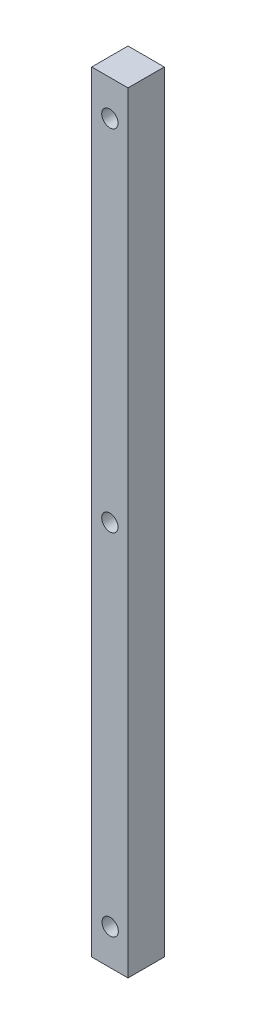
ISO-10303-21;
HEADER;
FILE_DESCRIPTION(('STEP AP214'),'2;1');
FILE_NAME('part.step','',(''),(''),'','','');
FILE_SCHEMA(('AUTOMOTIVE_DESIGN { 1 0 10303 214 1 1 1 1 }'));
ENDSEC;
DATA;
#1=APPLICATION_CONTEXT('core data for automotive mechanical design processes');
#2=APPLICATION_PROTOCOL_DEFINITION('international standard','automotive_design',2000,#1);
#3=PRODUCT_CONTEXT('',#1,'mechanical');
#4=PRODUCT('Part','Part','',(#3));
#5=PRODUCT_RELATED_PRODUCT_CATEGORY('part','',(#4));
#6=PRODUCT_DEFINITION_FORMATION('','',#4);
#7=PRODUCT_DEFINITION_CONTEXT('part definition',#1,'design');
#8=PRODUCT_DEFINITION('design','',#6,#7);
#9=PRODUCT_DEFINITION_SHAPE('','',#8);
#10=(LENGTH_UNIT() NAMED_UNIT(*) SI_UNIT(.MILLI.,.METRE.));
#11=(NAMED_UNIT(*) PLANE_ANGLE_UNIT() SI_UNIT($,.RADIAN.));
#12=(NAMED_UNIT(*) SI_UNIT($,.STERADIAN.) SOLID_ANGLE_UNIT());
#13=UNCERTAINTY_MEASURE_WITH_UNIT(LENGTH_MEASURE(1.E-05),#10,'distance_accuracy_value','');
#14=(GEOMETRIC_REPRESENTATION_CONTEXT(3) GLOBAL_UNCERTAINTY_ASSIGNED_CONTEXT((#13)) GLOBAL_UNIT_ASSIGNED_CONTEXT((#10,
#11,#12)) REPRESENTATION_CONTEXT('',''));
#15=CARTESIAN_POINT('',(0.,0.,0.));
#16=DIRECTION('',(0.,0.,1.));
#17=DIRECTION('',(1.,0.,0.));
#18=AXIS2_PLACEMENT_3D('',#15,#16,#17);
#19=CARTESIAN_POINT('',(-2.57937120896124,6.2613953488372,5.08));
#20=DIRECTION('',(1.,0.,0.));
#21=DIRECTION('',(0.,1.,0.));
#22=AXIS2_PLACEMENT_3D('',#19,#20,#21);
#23=PLANE('',#22);
#24=DIRECTION('',(0.,-1.,0.));
#25=VECTOR('',#24,1.);
#26=CARTESIAN_POINT('',(-2.57937120896124,6.2613953488372,0.));
#27=LINE('',#26,#25);
#28=CARTESIAN_POINT('',(-2.57937120896124,6.2613953488372,0.));
#29=VERTEX_POINT('',#28);
#30=CARTESIAN_POINT('',(-2.57937120896123,-101.688604651163,0.));
#31=VERTEX_POINT('',#30);
#32=EDGE_CURVE('E113',#29,#31,#27,.T.);
#33=ORIENTED_EDGE('',*,*,#32,.T.);
#34=DIRECTION('',(0.,0.,-1.));
#35=VECTOR('',#34,1.);
#36=CARTESIAN_POINT('',(-2.57937120896123,-101.688604651163,5.08));
#37=LINE('',#36,#35);
#38=CARTESIAN_POINT('',(-2.57937120896123,-101.688604651163,5.08));
#39=VERTEX_POINT('',#38);
#40=EDGE_CURVE('E13',#39,#31,#37,.T.);
#41=ORIENTED_EDGE('',*,*,#40,.F.);
#42=DIRECTION('',(0.,-1.,0.));
#43=VECTOR('',#42,1.);
#44=CARTESIAN_POINT('',(-2.57937120896124,6.2613953488372,5.08));
#45=LINE('',#44,#43);
#46=CARTESIAN_POINT('',(-2.57937120896124,6.2613953488372,5.08));
#47=VERTEX_POINT('',#46);
#48=EDGE_CURVE('E101',#47,#39,#45,.T.);
#49=ORIENTED_EDGE('',*,*,#48,.F.);
#50=DIRECTION('',(0.,0.,-1.));
#51=VECTOR('',#50,1.);
#52=CARTESIAN_POINT('',(-2.57937120896124,6.2613953488372,5.08));
#53=LINE('',#52,#51);
#54=EDGE_CURVE('E109',#47,#29,#53,.T.);
#55=ORIENTED_EDGE('',*,*,#54,.T.);
#56=EDGE_LOOP('',(#33,#41,#49,#55));
#57=FACE_BOUND('',#56,.T.);
#58=ADVANCED_FACE('F50',(#57),#23,.F.);
#59=CARTESIAN_POINT('',(-2.57937120896123,-101.688604651163,5.08));
#60=DIRECTION('',(0.,1.,0.));
#61=DIRECTION('',(0.,0.,1.));
#62=AXIS2_PLACEMENT_3D('',#59,#60,#61);
#63=PLANE('',#62);
#64=DIRECTION('',(1.,0.,0.));
#65=VECTOR('',#64,1.);
#66=CARTESIAN_POINT('',(-2.57937120896123,-101.688604651163,0.));
#67=LINE('',#66,#65);
#68=CARTESIAN_POINT('',(2.50062015503877,-101.688604651163,0.));
#69=VERTEX_POINT('',#68);
#70=EDGE_CURVE('E105',#31,#69,#67,.T.);
#71=ORIENTED_EDGE('',*,*,#70,.T.);
#72=DIRECTION('',(0.,0.,-1.));
#73=VECTOR('',#72,1.);
#74=CARTESIAN_POINT('',(2.50062015503877,-101.688604651163,5.08));
#75=LINE('',#74,#73);
#76=CARTESIAN_POINT('',(2.50062015503877,-101.688604651163,5.08));
#77=VERTEX_POINT('',#76);
#78=EDGE_CURVE('E58',#77,#69,#75,.T.);
#79=ORIENTED_EDGE('',*,*,#78,.F.);
#80=DIRECTION('',(1.,0.,0.));
#81=VECTOR('',#80,1.);
#82=CARTESIAN_POINT('',(-2.57937120896123,-101.688604651163,5.08));
#83=LINE('',#82,#81);
#84=EDGE_CURVE('E96',#39,#77,#83,.T.);
#85=ORIENTED_EDGE('',*,*,#84,.F.);
#86=ORIENTED_EDGE('',*,*,#40,.T.);
#87=EDGE_LOOP('',(#71,#79,#85,#86));
#88=FACE_BOUND('',#87,.T.);
#89=ADVANCED_FACE('F104',(#88),#63,.F.);
#90=CARTESIAN_POINT('',(2.50062015503876,6.2613953488372,5.08));
#91=DIRECTION('',(-1.,0.,0.));
#92=DIRECTION('',(0.,-1.,0.));
#93=AXIS2_PLACEMENT_3D('',#90,#91,#92);
#94=PLANE('',#93);
#95=DIRECTION('',(0.,1.,0.));
#96=VECTOR('',#95,1.);
#97=CARTESIAN_POINT('',(2.50062015503876,6.2613953488372,0.));
#98=LINE('',#97,#96);
#99=CARTESIAN_POINT('',(2.50062015503876,6.2613953488372,0.));
#100=VERTEX_POINT('',#99);
#101=EDGE_CURVE('E83',#69,#100,#98,.T.);
#102=ORIENTED_EDGE('',*,*,#101,.T.);
#103=DIRECTION('',(0.,0.,-1.));
#104=VECTOR('',#103,1.);
#105=CARTESIAN_POINT('',(2.50062015503876,6.2613953488372,5.08));
#106=LINE('',#105,#104);
#107=CARTESIAN_POINT('',(2.50062015503876,6.2613953488372,5.08));
#108=VERTEX_POINT('',#107);
#109=EDGE_CURVE('E106',#108,#100,#106,.T.);
#110=ORIENTED_EDGE('',*,*,#109,.F.);
#111=DIRECTION('',(0.,1.,0.));
#112=VECTOR('',#111,1.);
#113=CARTESIAN_POINT('',(2.50062015503876,6.2613953488372,5.08));
#114=LINE('',#113,#112);
#115=EDGE_CURVE('E99',#77,#108,#114,.T.);
#116=ORIENTED_EDGE('',*,*,#115,.F.);
#117=ORIENTED_EDGE('',*,*,#78,.T.);
#118=EDGE_LOOP('',(#102,#110,#116,#117));
#119=FACE_BOUND('',#118,.T.);
#120=ADVANCED_FACE('F107',(#119),#94,.F.);
#121=CARTESIAN_POINT('',(-2.57937120896124,6.2613953488372,5.08));
#122=DIRECTION('',(0.,-1.,0.));
#123=DIRECTION('',(0.,0.,-1.));
#124=AXIS2_PLACEMENT_3D('',#121,#122,#123);
#125=PLANE('',#124);
#126=DIRECTION('',(-1.,0.,0.));
#127=VECTOR('',#126,1.);
#128=CARTESIAN_POINT('',(-2.57937120896124,6.2613953488372,0.));
#129=LINE('',#128,#127);
#130=EDGE_CURVE('E89',#100,#29,#129,.T.);
#131=ORIENTED_EDGE('',*,*,#130,.T.);
#132=ORIENTED_EDGE('',*,*,#54,.F.);
#133=DIRECTION('',(-1.,0.,0.));
#134=VECTOR('',#133,1.);
#135=CARTESIAN_POINT('',(-2.57937120896124,6.2613953488372,5.08));
#136=LINE('',#135,#134);
#137=EDGE_CURVE('E66',#108,#47,#136,.T.);
#138=ORIENTED_EDGE('',*,*,#137,.F.);
#139=ORIENTED_EDGE('',*,*,#109,.T.);
#140=EDGE_LOOP('',(#131,#132,#138,#139));
#141=FACE_BOUND('',#140,.T.);
#142=ADVANCED_FACE('F121',(#141),#125,.F.);
#143=CARTESIAN_POINT('',(0.,0.,5.08));
#144=DIRECTION('',(0.,0.,1.));
#145=DIRECTION('',(1.,0.,0.));
#146=AXIS2_PLACEMENT_3D('',#143,#144,#145);
#147=PLANE('',#146);
#148=CARTESIAN_POINT('',(0.,-96.7136046511628,5.08));
#149=DIRECTION('',(0.,0.,1.));
#150=DIRECTION('',(1.,0.,0.));
#151=AXIS2_PLACEMENT_3D('',#148,#149,#150);
#152=CIRCLE('',#151,1.14300000000002);
#153=CARTESIAN_POINT('',(1.14300000000002,-96.7136046511628,5.08));
#154=VERTEX_POINT('',#153);
#155=EDGE_CURVE('E137',#154,#154,#152,.T.);
#156=ORIENTED_EDGE('',*,*,#155,.F.);
#157=EDGE_LOOP('',(#156));
#158=FACE_BOUND('',#157,.T.);
#159=CARTESIAN_POINT('',(-0.0393755269612427,1.2863953488372,5.08));
#160=DIRECTION('',(0.,0.,1.));
#161=DIRECTION('',(1.,0.,0.));
#162=AXIS2_PLACEMENT_3D('',#159,#160,#161);
#163=CIRCLE('',#162,1.143);
#164=CARTESIAN_POINT('',(1.10362447303876,1.2863953488372,5.08));
#165=VERTEX_POINT('',#164);
#166=EDGE_CURVE('E136',#165,#165,#163,.T.);
#167=ORIENTED_EDGE('',*,*,#166,.F.);
#168=EDGE_LOOP('',(#167));
#169=FACE_BOUND('',#168,.T.);
#170=CARTESIAN_POINT('',(-0.0393755269612362,-47.7136046511628,5.08));
#171=DIRECTION('',(0.,0.,1.));
#172=DIRECTION('',(1.,0.,0.));
#173=AXIS2_PLACEMENT_3D('',#170,#171,#172);
#174=CIRCLE('',#173,1.143);
#175=CARTESIAN_POINT('',(1.10362447303876,-47.7136046511628,5.08));
#176=VERTEX_POINT('',#175);
#177=EDGE_CURVE('E129',#176,#176,#174,.T.);
#178=ORIENTED_EDGE('',*,*,#177,.F.);
#179=EDGE_LOOP('',(#178));
#180=FACE_BOUND('',#179,.T.);
#181=ORIENTED_EDGE('',*,*,#48,.T.);
#182=ORIENTED_EDGE('',*,*,#84,.T.);
#183=ORIENTED_EDGE('',*,*,#115,.T.);
#184=ORIENTED_EDGE('',*,*,#137,.T.);
#185=EDGE_LOOP('',(#181,#182,#183,#184));
#186=FACE_BOUND('',#185,.T.);
#187=ADVANCED_FACE('F97',(#158,#169,#180,#186),#147,.T.);
#188=CARTESIAN_POINT('',(0.,0.,0.));
#189=DIRECTION('',(0.,0.,1.));
#190=DIRECTION('',(1.,0.,0.));
#191=AXIS2_PLACEMENT_3D('',#188,#189,#190);
#192=PLANE('',#191);
#193=CARTESIAN_POINT('',(0.,-96.7136046511628,0.));
#194=DIRECTION('',(0.,0.,1.));
#195=DIRECTION('',(1.,0.,0.));
#196=AXIS2_PLACEMENT_3D('',#193,#194,#195);
#197=CIRCLE('',#196,1.14300000000002);
#198=CARTESIAN_POINT('',(1.14300000000002,-96.7136046511628,0.));
#199=VERTEX_POINT('',#198);
#200=EDGE_CURVE('E133',#199,#199,#197,.F.);
#201=ORIENTED_EDGE('',*,*,#200,.F.);
#202=EDGE_LOOP('',(#201));
#203=FACE_BOUND('',#202,.T.);
#204=CARTESIAN_POINT('',(-0.0393755269612427,1.2863953488372,0.));
#205=DIRECTION('',(0.,0.,1.));
#206=DIRECTION('',(1.,0.,0.));
#207=AXIS2_PLACEMENT_3D('',#204,#205,#206);
#208=CIRCLE('',#207,1.143);
#209=CARTESIAN_POINT('',(1.10362447303876,1.2863953488372,0.));
#210=VERTEX_POINT('',#209);
#211=EDGE_CURVE('E132',#210,#210,#208,.F.);
#212=ORIENTED_EDGE('',*,*,#211,.F.);
#213=EDGE_LOOP('',(#212));
#214=FACE_BOUND('',#213,.T.);
#215=CARTESIAN_POINT('',(-0.0393755269612362,-47.7136046511628,0.));
#216=DIRECTION('',(0.,0.,1.));
#217=DIRECTION('',(1.,0.,0.));
#218=AXIS2_PLACEMENT_3D('',#215,#216,#217);
#219=CIRCLE('',#218,1.143);
#220=CARTESIAN_POINT('',(1.10362447303876,-47.7136046511628,0.));
#221=VERTEX_POINT('',#220);
#222=EDGE_CURVE('E116',#221,#221,#219,.F.);
#223=ORIENTED_EDGE('',*,*,#222,.F.);
#224=EDGE_LOOP('',(#223));
#225=FACE_BOUND('',#224,.T.);
#226=ORIENTED_EDGE('',*,*,#32,.F.);
#227=ORIENTED_EDGE('',*,*,#130,.F.);
#228=ORIENTED_EDGE('',*,*,#101,.F.);
#229=ORIENTED_EDGE('',*,*,#70,.F.);
#230=EDGE_LOOP('',(#226,#227,#228,#229));
#231=FACE_BOUND('',#230,.T.);
#232=ADVANCED_FACE('F124',(#203,#214,#225,#231),#192,.F.);
#233=CARTESIAN_POINT('',(-0.0393755269612362,-47.7136046511628,-0.00100000000000013));
#234=DIRECTION('',(0.,0.,1.));
#235=DIRECTION('',(1.,0.,0.));
#236=AXIS2_PLACEMENT_3D('',#233,#234,#235);
#237=CYLINDRICAL_SURFACE('',#236,1.143);
#238=ORIENTED_EDGE('',*,*,#177,.T.);
#239=EDGE_LOOP('',(#238));
#240=FACE_BOUND('',#239,.T.);
#241=ORIENTED_EDGE('',*,*,#222,.T.);
#242=EDGE_LOOP('',(#241));
#243=FACE_BOUND('',#242,.T.);
#244=ADVANCED_FACE('F154',(#240,#243),#237,.F.);
#245=CARTESIAN_POINT('',(-0.0393755269612427,1.2863953488372,-0.00100000000000013));
#246=DIRECTION('',(0.,0.,1.));
#247=DIRECTION('',(1.,0.,0.));
#248=AXIS2_PLACEMENT_3D('',#245,#246,#247);
#249=CYLINDRICAL_SURFACE('',#248,1.143);
#250=ORIENTED_EDGE('',*,*,#166,.T.);
#251=EDGE_LOOP('',(#250));
#252=FACE_BOUND('',#251,.T.);
#253=ORIENTED_EDGE('',*,*,#211,.T.);
#254=EDGE_LOOP('',(#253));
#255=FACE_BOUND('',#254,.T.);
#256=ADVANCED_FACE('F145',(#252,#255),#249,.F.);
#257=CARTESIAN_POINT('',(0.,-96.7136046511628,-0.00100000000000013));
#258=DIRECTION('',(0.,0.,1.));
#259=DIRECTION('',(1.,0.,0.));
#260=AXIS2_PLACEMENT_3D('',#257,#258,#259);
#261=CYLINDRICAL_SURFACE('',#260,1.14300000000002);
#262=ORIENTED_EDGE('',*,*,#155,.T.);
#263=EDGE_LOOP('',(#262));
#264=FACE_BOUND('',#263,.T.);
#265=ORIENTED_EDGE('',*,*,#200,.T.);
#266=EDGE_LOOP('',(#265));
#267=FACE_BOUND('',#266,.T.);
#268=ADVANCED_FACE('F204',(#264,#267),#261,.F.);
#269=CLOSED_SHELL('',(#58,#89,#120,#142,#187,#232,#244,#256,#268));
#270=MANIFOLD_SOLID_BREP('B2',#269);
#271=ADVANCED_BREP_SHAPE_REPRESENTATION('',(#18,#270),#14);
#272=SHAPE_DEFINITION_REPRESENTATION(#9,#271);
ENDSEC;
END-ISO-10303-21;
